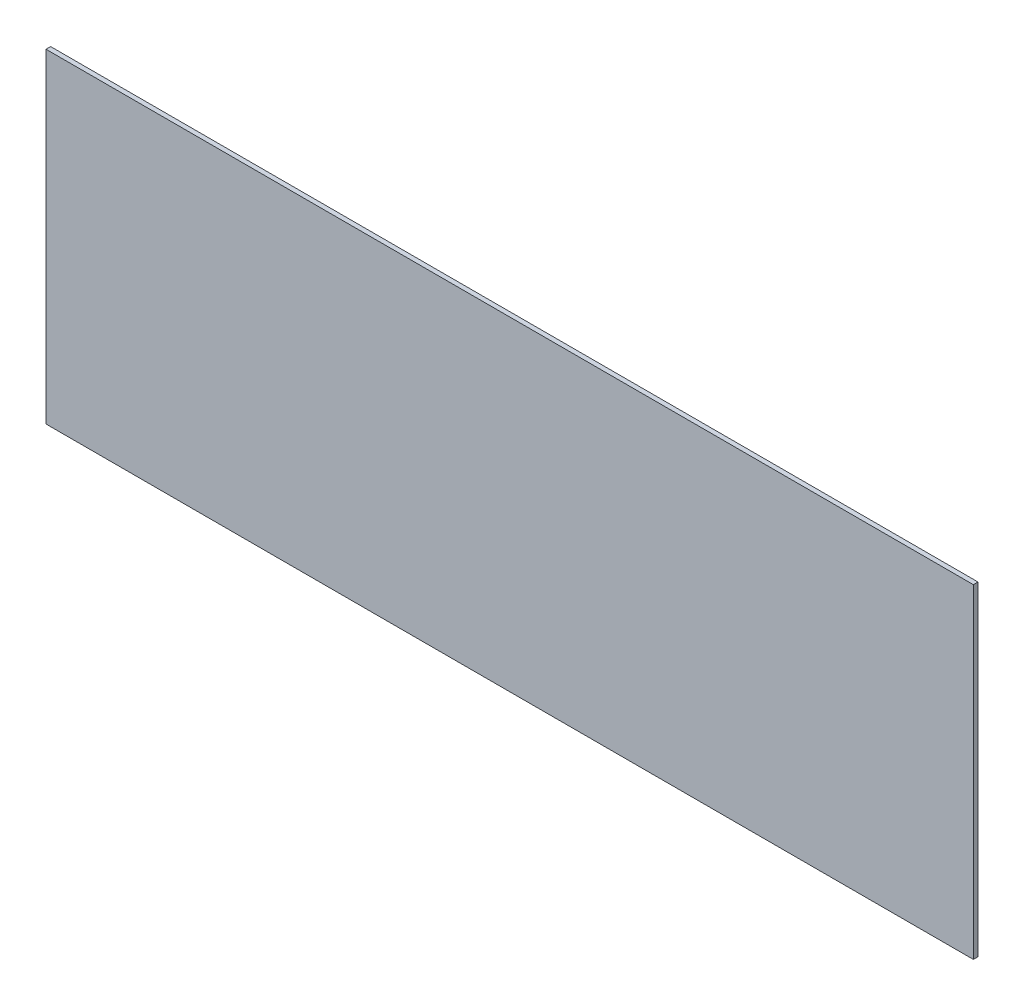
ISO-10303-21;
HEADER;
FILE_DESCRIPTION(('STEP AP214'),'2;1');
FILE_NAME('part.step','',(''),(''),'','','');
FILE_SCHEMA(('AUTOMOTIVE_DESIGN { 1 0 10303 214 1 1 1 1 }'));
ENDSEC;
DATA;
#1=APPLICATION_CONTEXT('core data for automotive mechanical design processes');
#2=APPLICATION_PROTOCOL_DEFINITION('international standard','automotive_design',2000,#1);
#3=PRODUCT_CONTEXT('',#1,'mechanical');
#4=PRODUCT('Part','Part','',(#3));
#5=PRODUCT_RELATED_PRODUCT_CATEGORY('part','',(#4));
#6=PRODUCT_DEFINITION_FORMATION('','',#4);
#7=PRODUCT_DEFINITION_CONTEXT('part definition',#1,'design');
#8=PRODUCT_DEFINITION('design','',#6,#7);
#9=PRODUCT_DEFINITION_SHAPE('','',#8);
#10=(LENGTH_UNIT() NAMED_UNIT(*) SI_UNIT(.MILLI.,.METRE.));
#11=(NAMED_UNIT(*) PLANE_ANGLE_UNIT() SI_UNIT($,.RADIAN.));
#12=(NAMED_UNIT(*) SI_UNIT($,.STERADIAN.) SOLID_ANGLE_UNIT());
#13=UNCERTAINTY_MEASURE_WITH_UNIT(LENGTH_MEASURE(1.E-05),#10,'distance_accuracy_value','');
#14=(GEOMETRIC_REPRESENTATION_CONTEXT(3) GLOBAL_UNCERTAINTY_ASSIGNED_CONTEXT((#13)) GLOBAL_UNIT_ASSIGNED_CONTEXT((#10,
#11,#12)) REPRESENTATION_CONTEXT('',''));
#15=CARTESIAN_POINT('',(0.,0.,0.));
#16=DIRECTION('',(0.,0.,1.));
#17=DIRECTION('',(1.,0.,0.));
#18=AXIS2_PLACEMENT_3D('',#15,#16,#17);
#19=CARTESIAN_POINT('',(100.,35.,1.));
#20=DIRECTION('',(-1.,0.,0.));
#21=DIRECTION('',(0.,-1.,0.));
#22=AXIS2_PLACEMENT_3D('',#19,#20,#21);
#23=PLANE('',#22);
#24=DIRECTION('',(0.,1.,0.));
#25=VECTOR('',#24,1.);
#26=CARTESIAN_POINT('',(100.,35.,0.));
#27=LINE('',#26,#25);
#28=CARTESIAN_POINT('',(100.,-35.,0.));
#29=VERTEX_POINT('',#28);
#30=CARTESIAN_POINT('',(100.,35.,0.));
#31=VERTEX_POINT('',#30);
#32=EDGE_CURVE('E110',#29,#31,#27,.T.);
#33=ORIENTED_EDGE('',*,*,#32,.T.);
#34=DIRECTION('',(0.,0.,-1.));
#35=VECTOR('',#34,1.);
#36=CARTESIAN_POINT('',(100.,35.,1.));
#37=LINE('',#36,#35);
#38=CARTESIAN_POINT('',(100.,35.,1.));
#39=VERTEX_POINT('',#38);
#40=EDGE_CURVE('E11',#39,#31,#37,.T.);
#41=ORIENTED_EDGE('',*,*,#40,.F.);
#42=DIRECTION('',(0.,1.,0.));
#43=VECTOR('',#42,1.);
#44=CARTESIAN_POINT('',(100.,35.,1.));
#45=LINE('',#44,#43);
#46=CARTESIAN_POINT('',(100.,-35.,1.));
#47=VERTEX_POINT('',#46);
#48=EDGE_CURVE('E98',#47,#39,#45,.T.);
#49=ORIENTED_EDGE('',*,*,#48,.F.);
#50=DIRECTION('',(0.,0.,-1.));
#51=VECTOR('',#50,1.);
#52=CARTESIAN_POINT('',(100.,-35.,1.));
#53=LINE('',#52,#51);
#54=EDGE_CURVE('E106',#47,#29,#53,.T.);
#55=ORIENTED_EDGE('',*,*,#54,.T.);
#56=EDGE_LOOP('',(#33,#41,#49,#55));
#57=FACE_BOUND('',#56,.T.);
#58=ADVANCED_FACE('F47',(#57),#23,.F.);
#59=CARTESIAN_POINT('',(-100.,35.,1.));
#60=DIRECTION('',(0.,-1.,0.));
#61=DIRECTION('',(0.,0.,-1.));
#62=AXIS2_PLACEMENT_3D('',#59,#60,#61);
#63=PLANE('',#62);
#64=DIRECTION('',(-1.,0.,0.));
#65=VECTOR('',#64,1.);
#66=CARTESIAN_POINT('',(-100.,35.,0.));
#67=LINE('',#66,#65);
#68=CARTESIAN_POINT('',(-100.,35.,0.));
#69=VERTEX_POINT('',#68);
#70=EDGE_CURVE('E102',#31,#69,#67,.T.);
#71=ORIENTED_EDGE('',*,*,#70,.T.);
#72=DIRECTION('',(0.,0.,-1.));
#73=VECTOR('',#72,1.);
#74=CARTESIAN_POINT('',(-100.,35.,1.));
#75=LINE('',#74,#73);
#76=CARTESIAN_POINT('',(-100.,35.,1.));
#77=VERTEX_POINT('',#76);
#78=EDGE_CURVE('E55',#77,#69,#75,.T.);
#79=ORIENTED_EDGE('',*,*,#78,.F.);
#80=DIRECTION('',(-1.,0.,0.));
#81=VECTOR('',#80,1.);
#82=CARTESIAN_POINT('',(-100.,35.,1.));
#83=LINE('',#82,#81);
#84=EDGE_CURVE('E93',#39,#77,#83,.T.);
#85=ORIENTED_EDGE('',*,*,#84,.F.);
#86=ORIENTED_EDGE('',*,*,#40,.T.);
#87=EDGE_LOOP('',(#71,#79,#85,#86));
#88=FACE_BOUND('',#87,.T.);
#89=ADVANCED_FACE('F101',(#88),#63,.F.);
#90=CARTESIAN_POINT('',(-100.,35.,1.));
#91=DIRECTION('',(1.,0.,0.));
#92=DIRECTION('',(0.,1.,0.));
#93=AXIS2_PLACEMENT_3D('',#90,#91,#92);
#94=PLANE('',#93);
#95=DIRECTION('',(0.,-1.,0.));
#96=VECTOR('',#95,1.);
#97=CARTESIAN_POINT('',(-100.,35.,0.));
#98=LINE('',#97,#96);
#99=CARTESIAN_POINT('',(-100.,-35.,0.));
#100=VERTEX_POINT('',#99);
#101=EDGE_CURVE('E80',#69,#100,#98,.T.);
#102=ORIENTED_EDGE('',*,*,#101,.T.);
#103=DIRECTION('',(0.,0.,-1.));
#104=VECTOR('',#103,1.);
#105=CARTESIAN_POINT('',(-100.,-35.,1.));
#106=LINE('',#105,#104);
#107=CARTESIAN_POINT('',(-100.,-35.,1.));
#108=VERTEX_POINT('',#107);
#109=EDGE_CURVE('E103',#108,#100,#106,.T.);
#110=ORIENTED_EDGE('',*,*,#109,.F.);
#111=DIRECTION('',(0.,-1.,0.));
#112=VECTOR('',#111,1.);
#113=CARTESIAN_POINT('',(-100.,35.,1.));
#114=LINE('',#113,#112);
#115=EDGE_CURVE('E96',#77,#108,#114,.T.);
#116=ORIENTED_EDGE('',*,*,#115,.F.);
#117=ORIENTED_EDGE('',*,*,#78,.T.);
#118=EDGE_LOOP('',(#102,#110,#116,#117));
#119=FACE_BOUND('',#118,.T.);
#120=ADVANCED_FACE('F104',(#119),#94,.F.);
#121=CARTESIAN_POINT('',(-100.,-35.,1.));
#122=DIRECTION('',(0.,1.,0.));
#123=DIRECTION('',(0.,0.,1.));
#124=AXIS2_PLACEMENT_3D('',#121,#122,#123);
#125=PLANE('',#124);
#126=DIRECTION('',(1.,0.,0.));
#127=VECTOR('',#126,1.);
#128=CARTESIAN_POINT('',(-100.,-35.,0.));
#129=LINE('',#128,#127);
#130=EDGE_CURVE('E86',#100,#29,#129,.T.);
#131=ORIENTED_EDGE('',*,*,#130,.T.);
#132=ORIENTED_EDGE('',*,*,#54,.F.);
#133=DIRECTION('',(1.,0.,0.));
#134=VECTOR('',#133,1.);
#135=CARTESIAN_POINT('',(-100.,-35.,1.));
#136=LINE('',#135,#134);
#137=EDGE_CURVE('E63',#108,#47,#136,.T.);
#138=ORIENTED_EDGE('',*,*,#137,.F.);
#139=ORIENTED_EDGE('',*,*,#109,.T.);
#140=EDGE_LOOP('',(#131,#132,#138,#139));
#141=FACE_BOUND('',#140,.T.);
#142=ADVANCED_FACE('F117',(#141),#125,.F.);
#143=CARTESIAN_POINT('',(0.,0.,1.));
#144=DIRECTION('',(0.,0.,1.));
#145=DIRECTION('',(1.,0.,0.));
#146=AXIS2_PLACEMENT_3D('',#143,#144,#145);
#147=PLANE('',#146);
#148=ORIENTED_EDGE('',*,*,#48,.T.);
#149=ORIENTED_EDGE('',*,*,#84,.T.);
#150=ORIENTED_EDGE('',*,*,#115,.T.);
#151=ORIENTED_EDGE('',*,*,#137,.T.);
#152=EDGE_LOOP('',(#148,#149,#150,#151));
#153=FACE_BOUND('',#152,.T.);
#154=ADVANCED_FACE('F94',(#153),#147,.T.);
#155=CARTESIAN_POINT('',(0.,0.,0.));
#156=DIRECTION('',(0.,0.,1.));
#157=DIRECTION('',(1.,0.,0.));
#158=AXIS2_PLACEMENT_3D('',#155,#156,#157);
#159=PLANE('',#158);
#160=ORIENTED_EDGE('',*,*,#32,.F.);
#161=ORIENTED_EDGE('',*,*,#130,.F.);
#162=ORIENTED_EDGE('',*,*,#101,.F.);
#163=ORIENTED_EDGE('',*,*,#70,.F.);
#164=EDGE_LOOP('',(#160,#161,#162,#163));
#165=FACE_BOUND('',#164,.T.);
#166=ADVANCED_FACE('F120',(#165),#159,.F.);
#167=CLOSED_SHELL('',(#58,#89,#120,#142,#154,#166));
#168=MANIFOLD_SOLID_BREP('B2',#167);
#169=ADVANCED_BREP_SHAPE_REPRESENTATION('',(#18,#168),#14);
#170=SHAPE_DEFINITION_REPRESENTATION(#9,#169);
ENDSEC;
END-ISO-10303-21;
